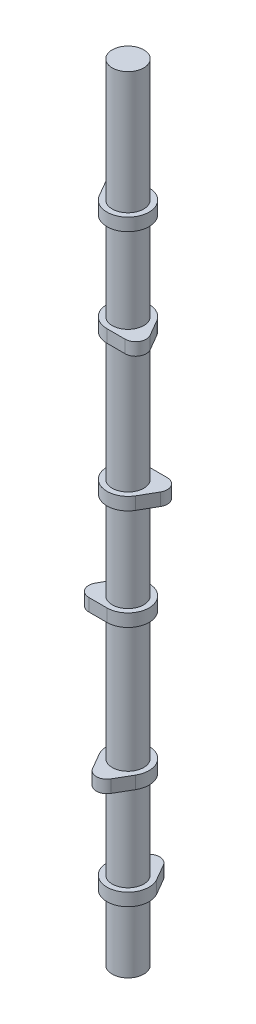
ISO-10303-21;
HEADER;
FILE_DESCRIPTION(('STEP AP214'),'2;1');
FILE_NAME('part.step','',(''),(''),'','','');
FILE_SCHEMA(('AUTOMOTIVE_DESIGN { 1 0 10303 214 1 1 1 1 }'));
ENDSEC;
DATA;
#1=APPLICATION_CONTEXT('core data for automotive mechanical design processes');
#2=APPLICATION_PROTOCOL_DEFINITION('international standard','automotive_design',2000,#1);
#3=PRODUCT_CONTEXT('',#1,'mechanical');
#4=PRODUCT('Part','Part','',(#3));
#5=PRODUCT_RELATED_PRODUCT_CATEGORY('part','',(#4));
#6=PRODUCT_DEFINITION_FORMATION('','',#4);
#7=PRODUCT_DEFINITION_CONTEXT('part definition',#1,'design');
#8=PRODUCT_DEFINITION('design','',#6,#7);
#9=PRODUCT_DEFINITION_SHAPE('','',#8);
#10=(LENGTH_UNIT() NAMED_UNIT(*) SI_UNIT(.MILLI.,.METRE.));
#11=(NAMED_UNIT(*) PLANE_ANGLE_UNIT() SI_UNIT($,.RADIAN.));
#12=(NAMED_UNIT(*) SI_UNIT($,.STERADIAN.) SOLID_ANGLE_UNIT());
#13=UNCERTAINTY_MEASURE_WITH_UNIT(LENGTH_MEASURE(1.E-05),#10,'distance_accuracy_value','');
#14=(GEOMETRIC_REPRESENTATION_CONTEXT(3) GLOBAL_UNCERTAINTY_ASSIGNED_CONTEXT((#13)) GLOBAL_UNIT_ASSIGNED_CONTEXT((#10,
#11,#12)) REPRESENTATION_CONTEXT('',''));
#15=CARTESIAN_POINT('',(0.,0.,0.));
#16=DIRECTION('',(0.,0.,1.));
#17=DIRECTION('',(1.,0.,0.));
#18=AXIS2_PLACEMENT_3D('',#15,#16,#17);
#19=CARTESIAN_POINT('',(0.,64.77,12.7));
#20=DIRECTION('',(0.,-1.,0.));
#21=DIRECTION('',(0.,0.,1.));
#22=AXIS2_PLACEMENT_3D('',#19,#20,#21);
#23=CYLINDRICAL_SURFACE('',#22,6.35);
#24=CARTESIAN_POINT('',(0.,57.15,12.7));
#25=DIRECTION('',(0.,1.,0.));
#26=DIRECTION('',(0.,0.,-1.));
#27=AXIS2_PLACEMENT_3D('',#24,#25,#26);
#28=CIRCLE('',#27,6.35);
#29=CARTESIAN_POINT('',(-5.49926131403129,57.15,15.875));
#30=VERTEX_POINT('',#29);
#31=CARTESIAN_POINT('',(5.49926131403107,57.15,15.875));
#32=VERTEX_POINT('',#31);
#33=EDGE_CURVE('E389',#30,#32,#28,.T.);
#34=ORIENTED_EDGE('',*,*,#33,.T.);
#35=DIRECTION('',(0.,-1.,0.));
#36=VECTOR('',#35,1.);
#37=CARTESIAN_POINT('',(5.49926131403107,64.77,15.875));
#38=LINE('',#37,#36);
#39=CARTESIAN_POINT('',(5.49926131403107,64.77,15.875));
#40=VERTEX_POINT('',#39);
#41=EDGE_CURVE('E408',#40,#32,#38,.T.);
#42=ORIENTED_EDGE('',*,*,#41,.F.);
#43=CARTESIAN_POINT('',(0.,64.77,12.7));
#44=DIRECTION('',(0.,1.,0.));
#45=DIRECTION('',(0.,0.,-1.));
#46=AXIS2_PLACEMENT_3D('',#43,#44,#45);
#47=CIRCLE('',#46,6.35);
#48=CARTESIAN_POINT('',(-5.49926131403129,64.77,15.875));
#49=VERTEX_POINT('',#48);
#50=EDGE_CURVE('E390',#49,#40,#47,.T.);
#51=ORIENTED_EDGE('',*,*,#50,.F.);
#52=DIRECTION('',(0.,-1.,0.));
#53=VECTOR('',#52,1.);
#54=CARTESIAN_POINT('',(-5.49926131403129,64.77,15.875));
#55=LINE('',#54,#53);
#56=EDGE_CURVE('E396',#49,#30,#55,.T.);
#57=ORIENTED_EDGE('',*,*,#56,.T.);
#58=EDGE_LOOP('',(#34,#42,#51,#57));
#59=FACE_BOUND('',#58,.T.);
#60=ADVANCED_FACE('F37',(#59),#23,.T.);
#61=CARTESIAN_POINT('',(5.49926131403107,64.77,15.875));
#62=DIRECTION('',(-0.866025403784435,0.,-0.500000000000006));
#63=DIRECTION('',(-0.500000000000006,0.,0.866025403784435));
#64=AXIS2_PLACEMENT_3D('',#61,#62,#63);
#65=PLANE('',#64);
#66=DIRECTION('',(0.500000000000006,0.,-0.866025403784435));
#67=VECTOR('',#66,1.);
#68=CARTESIAN_POINT('',(5.49926131403107,57.15,15.875));
#69=LINE('',#68,#67);
#70=CARTESIAN_POINT('',(10.9985226280623,57.15,6.35000000000008));
#71=VERTEX_POINT('',#70);
#72=EDGE_CURVE('E399',#32,#71,#69,.T.);
#73=ORIENTED_EDGE('',*,*,#72,.T.);
#74=DIRECTION('',(0.,-1.,0.));
#75=VECTOR('',#74,1.);
#76=CARTESIAN_POINT('',(10.9985226280623,64.77,6.35000000000008));
#77=LINE('',#76,#75);
#78=CARTESIAN_POINT('',(10.9985226280623,64.77,6.35000000000008));
#79=VERTEX_POINT('',#78);
#80=EDGE_CURVE('E406',#79,#71,#77,.T.);
#81=ORIENTED_EDGE('',*,*,#80,.F.);
#82=DIRECTION('',(0.500000000000006,0.,-0.866025403784435));
#83=VECTOR('',#82,1.);
#84=CARTESIAN_POINT('',(5.49926131403107,64.77,15.875));
#85=LINE('',#84,#83);
#86=EDGE_CURVE('E86',#40,#79,#85,.T.);
#87=ORIENTED_EDGE('',*,*,#86,.F.);
#88=ORIENTED_EDGE('',*,*,#41,.T.);
#89=EDGE_LOOP('',(#73,#81,#87,#88));
#90=FACE_BOUND('',#89,.T.);
#91=ADVANCED_FACE('F427',(#90),#65,.F.);
#92=CARTESIAN_POINT('',(0.,64.77,0.));
#93=DIRECTION('',(0.,-1.,0.));
#94=DIRECTION('',(0.,0.,1.));
#95=AXIS2_PLACEMENT_3D('',#92,#93,#94);
#96=CYLINDRICAL_SURFACE('',#95,12.7);
#97=CARTESIAN_POINT('',(0.,57.15,0.));
#98=DIRECTION('',(0.,1.,0.));
#99=DIRECTION('',(0.,0.,-1.));
#100=AXIS2_PLACEMENT_3D('',#97,#98,#99);
#101=CIRCLE('',#100,12.7);
#102=CARTESIAN_POINT('',(-10.9985226280624,57.15,6.34999999999992));
#103=VERTEX_POINT('',#102);
#104=EDGE_CURVE('E72',#71,#103,#101,.T.);
#105=ORIENTED_EDGE('',*,*,#104,.T.);
#106=DIRECTION('',(0.,-1.,0.));
#107=VECTOR('',#106,1.);
#108=CARTESIAN_POINT('',(-10.9985226280624,64.77,6.34999999999992));
#109=LINE('',#108,#107);
#110=CARTESIAN_POINT('',(-10.9985226280624,64.77,6.34999999999992));
#111=VERTEX_POINT('',#110);
#112=EDGE_CURVE('E404',#111,#103,#109,.T.);
#113=ORIENTED_EDGE('',*,*,#112,.F.);
#114=CARTESIAN_POINT('',(0.,64.77,0.));
#115=DIRECTION('',(0.,1.,0.));
#116=DIRECTION('',(0.,0.,-1.));
#117=AXIS2_PLACEMENT_3D('',#114,#115,#116);
#118=CIRCLE('',#117,12.7);
#119=EDGE_CURVE('E393',#79,#111,#118,.T.);
#120=ORIENTED_EDGE('',*,*,#119,.F.);
#121=ORIENTED_EDGE('',*,*,#80,.T.);
#122=EDGE_LOOP('',(#105,#113,#120,#121));
#123=FACE_BOUND('',#122,.T.);
#124=ADVANCED_FACE('F426',(#123),#96,.T.);
#125=CARTESIAN_POINT('',(-5.49926131403129,64.77,15.875));
#126=DIRECTION('',(0.866025403784442,0.,-0.499999999999994));
#127=DIRECTION('',(-0.499999999999994,0.,-0.866025403784442));
#128=AXIS2_PLACEMENT_3D('',#125,#126,#127);
#129=PLANE('',#128);
#130=DIRECTION('',(0.499999999999994,0.,0.866025403784442));
#131=VECTOR('',#130,1.);
#132=CARTESIAN_POINT('',(-5.49926131403129,57.15,15.875));
#133=LINE('',#132,#131);
#134=EDGE_CURVE('E78',#103,#30,#133,.T.);
#135=ORIENTED_EDGE('',*,*,#134,.T.);
#136=ORIENTED_EDGE('',*,*,#56,.F.);
#137=DIRECTION('',(0.499999999999994,0.,0.866025403784442));
#138=VECTOR('',#137,1.);
#139=CARTESIAN_POINT('',(-5.49926131403129,64.77,15.875));
#140=LINE('',#139,#138);
#141=EDGE_CURVE('E54',#111,#49,#140,.T.);
#142=ORIENTED_EDGE('',*,*,#141,.F.);
#143=ORIENTED_EDGE('',*,*,#112,.T.);
#144=EDGE_LOOP('',(#135,#136,#142,#143));
#145=FACE_BOUND('',#144,.T.);
#146=ADVANCED_FACE('F424',(#145),#129,.F.);
#147=CARTESIAN_POINT('',(0.,64.77,12.7));
#148=DIRECTION('',(0.,1.,0.));
#149=DIRECTION('',(0.,0.,-1.));
#150=AXIS2_PLACEMENT_3D('',#147,#148,#149);
#151=PLANE('',#150);
#152=CARTESIAN_POINT('',(0.,64.77,0.));
#153=DIRECTION('',(0.,1.,0.));
#154=DIRECTION('',(0.,0.,1.));
#155=AXIS2_PLACEMENT_3D('',#152,#153,#154);
#156=CIRCLE('',#155,9.5);
#157=CARTESIAN_POINT('',(0.,64.77,9.5));
#158=VERTEX_POINT('',#157);
#159=EDGE_CURVE('E386',#158,#158,#156,.F.);
#160=ORIENTED_EDGE('',*,*,#159,.T.);
#161=EDGE_LOOP('',(#160));
#162=FACE_BOUND('',#161,.T.);
#163=ORIENTED_EDGE('',*,*,#50,.T.);
#164=ORIENTED_EDGE('',*,*,#86,.T.);
#165=ORIENTED_EDGE('',*,*,#119,.T.);
#166=ORIENTED_EDGE('',*,*,#141,.T.);
#167=EDGE_LOOP('',(#163,#164,#165,#166));
#168=FACE_BOUND('',#167,.T.);
#169=ADVANCED_FACE('F418',(#162,#168),#151,.T.);
#170=CARTESIAN_POINT('',(0.,57.15,12.7));
#171=DIRECTION('',(0.,1.,0.));
#172=DIRECTION('',(0.,0.,-1.));
#173=AXIS2_PLACEMENT_3D('',#170,#171,#172);
#174=PLANE('',#173);
#175=CARTESIAN_POINT('',(0.,57.15,0.));
#176=DIRECTION('',(0.,1.,0.));
#177=DIRECTION('',(0.,0.,1.));
#178=AXIS2_PLACEMENT_3D('',#175,#176,#177);
#179=CIRCLE('',#178,9.5);
#180=CARTESIAN_POINT('',(0.,57.15,9.5));
#181=VERTEX_POINT('',#180);
#182=EDGE_CURVE('E46',#181,#181,#179,.F.);
#183=ORIENTED_EDGE('',*,*,#182,.F.);
#184=EDGE_LOOP('',(#183));
#185=FACE_BOUND('',#184,.T.);
#186=ORIENTED_EDGE('',*,*,#33,.F.);
#187=ORIENTED_EDGE('',*,*,#134,.F.);
#188=ORIENTED_EDGE('',*,*,#104,.F.);
#189=ORIENTED_EDGE('',*,*,#72,.F.);
#190=EDGE_LOOP('',(#186,#187,#188,#189));
#191=FACE_BOUND('',#190,.T.);
#192=ADVANCED_FACE('F415',(#185,#191),#174,.F.);
#193=CARTESIAN_POINT('',(0.,120.65,0.));
#194=DIRECTION('',(0.,-1.,0.));
#195=DIRECTION('',(0.,0.,-1.));
#196=AXIS2_PLACEMENT_3D('',#193,#194,#195);
#197=CYLINDRICAL_SURFACE('',#196,9.5);
#198=CARTESIAN_POINT('',(0.,3.80999999999999,0.));
#199=DIRECTION('',(0.,1.,0.));
#200=DIRECTION('',(0.,0.,1.));
#201=AXIS2_PLACEMENT_3D('',#198,#199,#200);
#202=CIRCLE('',#201,9.5);
#203=CARTESIAN_POINT('',(0.,3.80999999999999,9.5));
#204=VERTEX_POINT('',#203);
#205=EDGE_CURVE('E40',#204,#204,#202,.T.);
#206=ORIENTED_EDGE('',*,*,#205,.T.);
#207=EDGE_LOOP('',(#206));
#208=FACE_BOUND('',#207,.T.);
#209=ORIENTED_EDGE('',*,*,#182,.T.);
#210=EDGE_LOOP('',(#209));
#211=FACE_BOUND('',#210,.T.);
#212=ADVANCED_FACE('F413',(#208,#211),#197,.T.);
#213=ORIENTED_EDGE('',*,*,#159,.F.);
#214=EDGE_LOOP('',(#213));
#215=FACE_BOUND('',#214,.T.);
#216=CARTESIAN_POINT('',(0.,142.24,0.));
#217=DIRECTION('',(0.,1.,0.));
#218=DIRECTION('',(0.866025403784436,0.,-0.500000000000004));
#219=AXIS2_PLACEMENT_3D('',#216,#217,#218);
#220=CIRCLE('',#219,9.5);
#221=CARTESIAN_POINT('',(8.22724133595215,142.24,-4.75000000000004));
#222=VERTEX_POINT('',#221);
#223=EDGE_CURVE('E348',#222,#222,#220,.T.);
#224=ORIENTED_EDGE('',*,*,#223,.F.);
#225=EDGE_LOOP('',(#224));
#226=FACE_BOUND('',#225,.T.);
#227=ADVANCED_FACE('F440',(#215,#226),#197,.T.);
#228=CARTESIAN_POINT('',(0.,3.81,-12.7));
#229=DIRECTION('',(0.,-1.,0.));
#230=DIRECTION('',(0.,0.,-1.));
#231=AXIS2_PLACEMENT_3D('',#228,#229,#230);
#232=CYLINDRICAL_SURFACE('',#231,6.35);
#233=CARTESIAN_POINT('',(0.,-3.81,-12.7));
#234=DIRECTION('',(0.,1.,0.));
#235=DIRECTION('',(0.,0.,1.));
#236=AXIS2_PLACEMENT_3D('',#233,#234,#235);
#237=CIRCLE('',#236,6.35);
#238=CARTESIAN_POINT('',(5.49926131403118,-3.81,-15.875));
#239=VERTEX_POINT('',#238);
#240=CARTESIAN_POINT('',(-5.49926131403118,-3.81,-15.875));
#241=VERTEX_POINT('',#240);
#242=EDGE_CURVE('E356',#239,#241,#237,.T.);
#243=ORIENTED_EDGE('',*,*,#242,.T.);
#244=DIRECTION('',(0.,-1.,0.));
#245=VECTOR('',#244,1.);
#246=CARTESIAN_POINT('',(-5.49926131403118,3.81,-15.875));
#247=LINE('',#246,#245);
#248=CARTESIAN_POINT('',(-5.49926131403118,3.81,-15.875));
#249=VERTEX_POINT('',#248);
#250=EDGE_CURVE('E383',#249,#241,#247,.T.);
#251=ORIENTED_EDGE('',*,*,#250,.F.);
#252=CARTESIAN_POINT('',(0.,3.81,-12.7));
#253=DIRECTION('',(0.,1.,0.));
#254=DIRECTION('',(0.,0.,1.));
#255=AXIS2_PLACEMENT_3D('',#252,#253,#254);
#256=CIRCLE('',#255,6.35);
#257=CARTESIAN_POINT('',(5.49926131403118,3.81,-15.875));
#258=VERTEX_POINT('',#257);
#259=EDGE_CURVE('E357',#258,#249,#256,.T.);
#260=ORIENTED_EDGE('',*,*,#259,.F.);
#261=DIRECTION('',(0.,-1.,0.));
#262=VECTOR('',#261,1.);
#263=CARTESIAN_POINT('',(5.49926131403118,3.81,-15.875));
#264=LINE('',#263,#262);
#265=EDGE_CURVE('E367',#258,#239,#264,.T.);
#266=ORIENTED_EDGE('',*,*,#265,.T.);
#267=EDGE_LOOP('',(#243,#251,#260,#266));
#268=FACE_BOUND('',#267,.T.);
#269=ADVANCED_FACE('F443',(#268),#232,.T.);
#270=CARTESIAN_POINT('',(-5.49926131403118,3.81,-15.875));
#271=DIRECTION('',(0.866025403784438,0.,0.5));
#272=DIRECTION('',(0.5,0.,-0.866025403784439));
#273=AXIS2_PLACEMENT_3D('',#270,#271,#272);
#274=PLANE('',#273);
#275=DIRECTION('',(-0.5,0.,0.866025403784439));
#276=VECTOR('',#275,1.);
#277=CARTESIAN_POINT('',(-5.49926131403118,-3.81,-15.875));
#278=LINE('',#277,#276);
#279=CARTESIAN_POINT('',(-10.9985226280624,-3.81,-6.35));
#280=VERTEX_POINT('',#279);
#281=EDGE_CURVE('E370',#241,#280,#278,.T.);
#282=ORIENTED_EDGE('',*,*,#281,.T.);
#283=DIRECTION('',(0.,-1.,0.));
#284=VECTOR('',#283,1.);
#285=CARTESIAN_POINT('',(-10.9985226280624,3.81,-6.35));
#286=LINE('',#285,#284);
#287=CARTESIAN_POINT('',(-10.9985226280624,3.81,-6.35));
#288=VERTEX_POINT('',#287);
#289=EDGE_CURVE('E380',#288,#280,#286,.T.);
#290=ORIENTED_EDGE('',*,*,#289,.F.);
#291=DIRECTION('',(-0.5,0.,0.866025403784439));
#292=VECTOR('',#291,1.);
#293=CARTESIAN_POINT('',(-5.49926131403118,3.81,-15.875));
#294=LINE('',#293,#292);
#295=EDGE_CURVE('E360',#249,#288,#294,.T.);
#296=ORIENTED_EDGE('',*,*,#295,.F.);
#297=ORIENTED_EDGE('',*,*,#250,.T.);
#298=EDGE_LOOP('',(#282,#290,#296,#297));
#299=FACE_BOUND('',#298,.T.);
#300=ADVANCED_FACE('F448',(#299),#274,.F.);
#301=CARTESIAN_POINT('',(0.,3.81,0.));
#302=DIRECTION('',(0.,-1.,0.));
#303=DIRECTION('',(0.,0.,-1.));
#304=AXIS2_PLACEMENT_3D('',#301,#302,#303);
#305=CYLINDRICAL_SURFACE('',#304,12.7);
#306=CARTESIAN_POINT('',(0.,-3.81,0.));
#307=DIRECTION('',(0.,1.,0.));
#308=DIRECTION('',(0.,0.,1.));
#309=AXIS2_PLACEMENT_3D('',#306,#307,#308);
#310=CIRCLE('',#309,12.7);
#311=CARTESIAN_POINT('',(10.9985226280624,-3.81,-6.35));
#312=VERTEX_POINT('',#311);
#313=EDGE_CURVE('E372',#280,#312,#310,.T.);
#314=ORIENTED_EDGE('',*,*,#313,.T.);
#315=DIRECTION('',(0.,-1.,0.));
#316=VECTOR('',#315,1.);
#317=CARTESIAN_POINT('',(10.9985226280624,3.81,-6.35));
#318=LINE('',#317,#316);
#319=CARTESIAN_POINT('',(10.9985226280624,3.81,-6.35));
#320=VERTEX_POINT('',#319);
#321=EDGE_CURVE('E377',#320,#312,#318,.T.);
#322=ORIENTED_EDGE('',*,*,#321,.F.);
#323=CARTESIAN_POINT('',(0.,3.81,0.));
#324=DIRECTION('',(0.,1.,0.));
#325=DIRECTION('',(0.,0.,1.));
#326=AXIS2_PLACEMENT_3D('',#323,#324,#325);
#327=CIRCLE('',#326,12.7);
#328=EDGE_CURVE('E363',#288,#320,#327,.T.);
#329=ORIENTED_EDGE('',*,*,#328,.F.);
#330=ORIENTED_EDGE('',*,*,#289,.T.);
#331=EDGE_LOOP('',(#314,#322,#329,#330));
#332=FACE_BOUND('',#331,.T.);
#333=ADVANCED_FACE('F452',(#332),#305,.T.);
#334=CARTESIAN_POINT('',(5.49926131403118,3.81,-15.875));
#335=DIRECTION('',(-0.866025403784439,0.,0.5));
#336=DIRECTION('',(0.5,0.,0.866025403784439));
#337=AXIS2_PLACEMENT_3D('',#334,#335,#336);
#338=PLANE('',#337);
#339=DIRECTION('',(-0.5,0.,-0.866025403784439));
#340=VECTOR('',#339,1.);
#341=CARTESIAN_POINT('',(5.49926131403118,-3.81,-15.875));
#342=LINE('',#341,#340);
#343=EDGE_CURVE('E361',#312,#239,#342,.T.);
#344=ORIENTED_EDGE('',*,*,#343,.T.);
#345=ORIENTED_EDGE('',*,*,#265,.F.);
#346=DIRECTION('',(-0.5,0.,-0.866025403784439));
#347=VECTOR('',#346,1.);
#348=CARTESIAN_POINT('',(5.49926131403118,3.81,-15.875));
#349=LINE('',#348,#347);
#350=EDGE_CURVE('E365',#320,#258,#349,.T.);
#351=ORIENTED_EDGE('',*,*,#350,.F.);
#352=ORIENTED_EDGE('',*,*,#321,.T.);
#353=EDGE_LOOP('',(#344,#345,#351,#352));
#354=FACE_BOUND('',#353,.T.);
#355=ADVANCED_FACE('F456',(#354),#338,.F.);
#356=CARTESIAN_POINT('',(0.,3.81,-12.7));
#357=DIRECTION('',(0.,1.,0.));
#358=DIRECTION('',(0.,0.,1.));
#359=AXIS2_PLACEMENT_3D('',#356,#357,#358);
#360=PLANE('',#359);
#361=ORIENTED_EDGE('',*,*,#205,.F.);
#362=EDGE_LOOP('',(#361));
#363=FACE_BOUND('',#362,.T.);
#364=ORIENTED_EDGE('',*,*,#259,.T.);
#365=ORIENTED_EDGE('',*,*,#295,.T.);
#366=ORIENTED_EDGE('',*,*,#328,.T.);
#367=ORIENTED_EDGE('',*,*,#350,.T.);
#368=EDGE_LOOP('',(#364,#365,#366,#367));
#369=FACE_BOUND('',#368,.T.);
#370=ADVANCED_FACE('F460',(#363,#369),#360,.T.);
#371=CARTESIAN_POINT('',(0.,-3.81,-12.7));
#372=DIRECTION('',(0.,1.,0.));
#373=DIRECTION('',(0.,0.,1.));
#374=AXIS2_PLACEMENT_3D('',#371,#372,#373);
#375=PLANE('',#374);
#376=CARTESIAN_POINT('',(0.,-3.80999999999999,0.));
#377=DIRECTION('',(0.,1.,0.));
#378=DIRECTION('',(0.,0.,1.));
#379=AXIS2_PLACEMENT_3D('',#376,#377,#378);
#380=CIRCLE('',#379,9.5);
#381=CARTESIAN_POINT('',(0.,-3.80999999999999,9.5));
#382=VERTEX_POINT('',#381);
#383=EDGE_CURVE('E11',#382,#382,#380,.T.);
#384=ORIENTED_EDGE('',*,*,#383,.T.);
#385=EDGE_LOOP('',(#384));
#386=FACE_BOUND('',#385,.T.);
#387=ORIENTED_EDGE('',*,*,#242,.F.);
#388=ORIENTED_EDGE('',*,*,#343,.F.);
#389=ORIENTED_EDGE('',*,*,#313,.F.);
#390=ORIENTED_EDGE('',*,*,#281,.F.);
#391=EDGE_LOOP('',(#387,#388,#389,#390));
#392=FACE_BOUND('',#391,.T.);
#393=ADVANCED_FACE('F462',(#386,#392),#375,.F.);
#394=ORIENTED_EDGE('',*,*,#383,.F.);
#395=EDGE_LOOP('',(#394));
#396=FACE_BOUND('',#395,.T.);
#397=CARTESIAN_POINT('',(0.,-43.34,0.));
#398=DIRECTION('',(0.,-1.,0.));
#399=DIRECTION('',(0.,0.,-1.));
#400=AXIS2_PLACEMENT_3D('',#397,#398,#399);
#401=CIRCLE('',#400,9.5);
#402=CARTESIAN_POINT('',(0.,-43.34,-9.5));
#403=VERTEX_POINT('',#402);
#404=EDGE_CURVE('E351',#403,#403,#401,.T.);
#405=ORIENTED_EDGE('',*,*,#404,.F.);
#406=EDGE_LOOP('',(#405));
#407=FACE_BOUND('',#406,.T.);
#408=ADVANCED_FACE('F445',(#396,#407),#197,.T.);
#409=CARTESIAN_POINT('',(0.,-43.34,0.));
#410=DIRECTION('',(0.,-1.,0.));
#411=DIRECTION('',(0.,0.,-1.));
#412=AXIS2_PLACEMENT_3D('',#409,#410,#411);
#413=PLANE('',#412);
#414=ORIENTED_EDGE('',*,*,#404,.T.);
#415=EDGE_LOOP('',(#414));
#416=FACE_BOUND('',#415,.T.);
#417=ADVANCED_FACE('F469',(#416),#413,.T.);
#418=CARTESIAN_POINT('',(10.9985226280624,210.82,-6.34999999999997));
#419=DIRECTION('',(0.,-1.,0.));
#420=DIRECTION('',(0.86602540378444,0.,-0.499999999999998));
#421=AXIS2_PLACEMENT_3D('',#418,#419,#420);
#422=CYLINDRICAL_SURFACE('',#421,6.35);
#423=CARTESIAN_POINT('',(10.9985226280624,203.2,-6.34999999999997));
#424=DIRECTION('',(0.,1.,0.));
#425=DIRECTION('',(-0.86602540378444,0.,0.499999999999998));
#426=AXIS2_PLACEMENT_3D('',#423,#424,#425);
#427=CIRCLE('',#426,6.35);
#428=CARTESIAN_POINT('',(16.4977839420936,203.2,-3.17499999999997));
#429=VERTEX_POINT('',#428);
#430=CARTESIAN_POINT('',(10.9985226280624,203.2,-12.7));
#431=VERTEX_POINT('',#430);
#432=EDGE_CURVE('E315',#429,#431,#427,.T.);
#433=ORIENTED_EDGE('',*,*,#432,.T.);
#434=DIRECTION('',(0.,-1.,0.));
#435=VECTOR('',#434,1.);
#436=CARTESIAN_POINT('',(10.9985226280624,210.82,-12.7));
#437=LINE('',#436,#435);
#438=CARTESIAN_POINT('',(10.9985226280624,210.82,-12.7));
#439=VERTEX_POINT('',#438);
#440=EDGE_CURVE('E342',#439,#431,#437,.T.);
#441=ORIENTED_EDGE('',*,*,#440,.F.);
#442=CARTESIAN_POINT('',(10.9985226280624,210.82,-6.34999999999997));
#443=DIRECTION('',(0.,1.,0.));
#444=DIRECTION('',(-0.86602540378444,0.,0.499999999999998));
#445=AXIS2_PLACEMENT_3D('',#442,#443,#444);
#446=CIRCLE('',#445,6.35);
#447=CARTESIAN_POINT('',(16.4977839420936,210.82,-3.17499999999997));
#448=VERTEX_POINT('',#447);
#449=EDGE_CURVE('E316',#448,#439,#446,.T.);
#450=ORIENTED_EDGE('',*,*,#449,.F.);
#451=DIRECTION('',(0.,-1.,0.));
#452=VECTOR('',#451,1.);
#453=CARTESIAN_POINT('',(16.4977839420936,210.82,-3.17499999999997));
#454=LINE('',#453,#452);
#455=EDGE_CURVE('E326',#448,#429,#454,.T.);
#456=ORIENTED_EDGE('',*,*,#455,.T.);
#457=EDGE_LOOP('',(#433,#441,#450,#456));
#458=FACE_BOUND('',#457,.T.);
#459=ADVANCED_FACE('F472',(#458),#422,.T.);
#460=CARTESIAN_POINT('',(10.9985226280624,210.82,-12.7));
#461=DIRECTION('',(0.,0.,1.));
#462=DIRECTION('',(1.,0.,0.));
#463=AXIS2_PLACEMENT_3D('',#460,#461,#462);
#464=PLANE('',#463);
#465=DIRECTION('',(-1.,0.,0.));
#466=VECTOR('',#465,1.);
#467=CARTESIAN_POINT('',(10.9985226280624,203.2,-12.7));
#468=LINE('',#467,#466);
#469=CARTESIAN_POINT('',(0.,203.2,-12.7));
#470=VERTEX_POINT('',#469);
#471=EDGE_CURVE('E329',#431,#470,#468,.T.);
#472=ORIENTED_EDGE('',*,*,#471,.T.);
#473=DIRECTION('',(0.,-1.,0.));
#474=VECTOR('',#473,1.);
#475=CARTESIAN_POINT('',(0.,210.82,-12.7));
#476=LINE('',#475,#474);
#477=CARTESIAN_POINT('',(0.,210.82,-12.7));
#478=VERTEX_POINT('',#477);
#479=EDGE_CURVE('E339',#478,#470,#476,.T.);
#480=ORIENTED_EDGE('',*,*,#479,.F.);
#481=DIRECTION('',(-1.,0.,0.));
#482=VECTOR('',#481,1.);
#483=CARTESIAN_POINT('',(10.9985226280624,210.82,-12.7));
#484=LINE('',#483,#482);
#485=EDGE_CURVE('E319',#439,#478,#484,.T.);
#486=ORIENTED_EDGE('',*,*,#485,.F.);
#487=ORIENTED_EDGE('',*,*,#440,.T.);
#488=EDGE_LOOP('',(#472,#480,#486,#487));
#489=FACE_BOUND('',#488,.T.);
#490=ADVANCED_FACE('F476',(#489),#464,.F.);
#491=CARTESIAN_POINT('',(0.,210.82,0.));
#492=DIRECTION('',(0.,-1.,0.));
#493=DIRECTION('',(0.86602540378444,0.,-0.499999999999998));
#494=AXIS2_PLACEMENT_3D('',#491,#492,#493);
#495=CYLINDRICAL_SURFACE('',#494,12.7);
#496=CARTESIAN_POINT('',(0.,203.2,0.));
#497=DIRECTION('',(0.,1.,0.));
#498=DIRECTION('',(-0.86602540378444,0.,0.499999999999998));
#499=AXIS2_PLACEMENT_3D('',#496,#497,#498);
#500=CIRCLE('',#499,12.7);
#501=CARTESIAN_POINT('',(10.9985226280624,203.2,6.35000000000002));
#502=VERTEX_POINT('',#501);
#503=EDGE_CURVE('E331',#470,#502,#500,.T.);
#504=ORIENTED_EDGE('',*,*,#503,.T.);
#505=DIRECTION('',(0.,-1.,0.));
#506=VECTOR('',#505,1.);
#507=CARTESIAN_POINT('',(10.9985226280624,210.82,6.35000000000002));
#508=LINE('',#507,#506);
#509=CARTESIAN_POINT('',(10.9985226280624,210.82,6.35000000000002));
#510=VERTEX_POINT('',#509);
#511=EDGE_CURVE('E336',#510,#502,#508,.T.);
#512=ORIENTED_EDGE('',*,*,#511,.F.);
#513=CARTESIAN_POINT('',(0.,210.82,0.));
#514=DIRECTION('',(0.,1.,0.));
#515=DIRECTION('',(-0.86602540378444,0.,0.499999999999998));
#516=AXIS2_PLACEMENT_3D('',#513,#514,#515);
#517=CIRCLE('',#516,12.7);
#518=EDGE_CURVE('E322',#478,#510,#517,.T.);
#519=ORIENTED_EDGE('',*,*,#518,.F.);
#520=ORIENTED_EDGE('',*,*,#479,.T.);
#521=EDGE_LOOP('',(#504,#512,#519,#520));
#522=FACE_BOUND('',#521,.T.);
#523=ADVANCED_FACE('F480',(#522),#495,.T.);
#524=CARTESIAN_POINT('',(16.4977839420936,210.82,-3.17499999999997));
#525=DIRECTION('',(-0.866025403784438,0.,-0.500000000000002));
#526=DIRECTION('',(-0.500000000000002,0.,0.866025403784438));
#527=AXIS2_PLACEMENT_3D('',#524,#525,#526);
#528=PLANE('',#527);
#529=DIRECTION('',(0.500000000000002,0.,-0.866025403784438));
#530=VECTOR('',#529,1.);
#531=CARTESIAN_POINT('',(16.4977839420936,203.2,-3.17499999999997));
#532=LINE('',#531,#530);
#533=EDGE_CURVE('E320',#502,#429,#532,.T.);
#534=ORIENTED_EDGE('',*,*,#533,.T.);
#535=ORIENTED_EDGE('',*,*,#455,.F.);
#536=DIRECTION('',(0.500000000000002,0.,-0.866025403784438));
#537=VECTOR('',#536,1.);
#538=CARTESIAN_POINT('',(16.4977839420936,210.82,-3.17499999999997));
#539=LINE('',#538,#537);
#540=EDGE_CURVE('E324',#510,#448,#539,.T.);
#541=ORIENTED_EDGE('',*,*,#540,.F.);
#542=ORIENTED_EDGE('',*,*,#511,.T.);
#543=EDGE_LOOP('',(#534,#535,#541,#542));
#544=FACE_BOUND('',#543,.T.);
#545=ADVANCED_FACE('F484',(#544),#528,.F.);
#546=CARTESIAN_POINT('',(10.9985226280624,210.82,-6.34999999999997));
#547=DIRECTION('',(0.,1.,0.));
#548=DIRECTION('',(-0.86602540378444,0.,0.499999999999998));
#549=AXIS2_PLACEMENT_3D('',#546,#547,#548);
#550=PLANE('',#549);
#551=CARTESIAN_POINT('',(0.,210.82,0.));
#552=DIRECTION('',(0.,1.,0.));
#553=DIRECTION('',(0.866025403784436,0.,-0.500000000000004));
#554=AXIS2_PLACEMENT_3D('',#551,#552,#553);
#555=CIRCLE('',#554,9.5);
#556=CARTESIAN_POINT('',(8.22724133595215,210.82,-4.75000000000004));
#557=VERTEX_POINT('',#556);
#558=EDGE_CURVE('E312',#557,#557,#555,.F.);
#559=ORIENTED_EDGE('',*,*,#558,.T.);
#560=EDGE_LOOP('',(#559));
#561=FACE_BOUND('',#560,.T.);
#562=ORIENTED_EDGE('',*,*,#449,.T.);
#563=ORIENTED_EDGE('',*,*,#485,.T.);
#564=ORIENTED_EDGE('',*,*,#518,.T.);
#565=ORIENTED_EDGE('',*,*,#540,.T.);
#566=EDGE_LOOP('',(#562,#563,#564,#565));
#567=FACE_BOUND('',#566,.T.);
#568=ADVANCED_FACE('F488',(#561,#567),#550,.T.);
#569=CARTESIAN_POINT('',(10.9985226280624,203.2,-6.34999999999997));
#570=DIRECTION('',(0.,1.,0.));
#571=DIRECTION('',(-0.86602540378444,0.,0.499999999999998));
#572=AXIS2_PLACEMENT_3D('',#569,#570,#571);
#573=PLANE('',#572);
#574=CARTESIAN_POINT('',(0.,203.2,0.));
#575=DIRECTION('',(0.,1.,0.));
#576=DIRECTION('',(0.866025403784436,0.,-0.500000000000004));
#577=AXIS2_PLACEMENT_3D('',#574,#575,#576);
#578=CIRCLE('',#577,9.5);
#579=CARTESIAN_POINT('',(8.22724133595215,203.2,-4.75000000000004));
#580=VERTEX_POINT('',#579);
#581=EDGE_CURVE('E345',#580,#580,#578,.F.);
#582=ORIENTED_EDGE('',*,*,#581,.F.);
#583=EDGE_LOOP('',(#582));
#584=FACE_BOUND('',#583,.T.);
#585=ORIENTED_EDGE('',*,*,#432,.F.);
#586=ORIENTED_EDGE('',*,*,#533,.F.);
#587=ORIENTED_EDGE('',*,*,#503,.F.);
#588=ORIENTED_EDGE('',*,*,#471,.F.);
#589=EDGE_LOOP('',(#585,#586,#587,#588));
#590=FACE_BOUND('',#589,.T.);
#591=ADVANCED_FACE('F490',(#584,#590),#573,.F.);
#592=CARTESIAN_POINT('',(0.,266.7,0.));
#593=DIRECTION('',(0.,-1.,0.));
#594=DIRECTION('',(-0.866025403784436,0.,0.500000000000004));
#595=AXIS2_PLACEMENT_3D('',#592,#593,#594);
#596=CYLINDRICAL_SURFACE('',#595,9.5);
#597=CARTESIAN_POINT('',(0.,149.86,0.));
#598=DIRECTION('',(0.,1.,0.));
#599=DIRECTION('',(0.866025403784436,0.,-0.500000000000004));
#600=AXIS2_PLACEMENT_3D('',#597,#598,#599);
#601=CIRCLE('',#600,9.5);
#602=CARTESIAN_POINT('',(8.22724133595215,149.86,-4.75000000000004));
#603=VERTEX_POINT('',#602);
#604=EDGE_CURVE('E311',#603,#603,#601,.T.);
#605=ORIENTED_EDGE('',*,*,#604,.T.);
#606=EDGE_LOOP('',(#605));
#607=FACE_BOUND('',#606,.T.);
#608=ORIENTED_EDGE('',*,*,#581,.T.);
#609=EDGE_LOOP('',(#608));
#610=FACE_BOUND('',#609,.T.);
#611=ADVANCED_FACE('F493',(#607,#610),#596,.T.);
#612=ORIENTED_EDGE('',*,*,#558,.F.);
#613=EDGE_LOOP('',(#612));
#614=FACE_BOUND('',#613,.T.);
#615=CARTESIAN_POINT('',(0.,288.29,0.));
#616=DIRECTION('',(0.,1.,0.));
#617=DIRECTION('',(-0.866025403784443,0.,-0.499999999999992));
#618=AXIS2_PLACEMENT_3D('',#615,#616,#617);
#619=CIRCLE('',#618,9.5);
#620=CARTESIAN_POINT('',(-8.22724133595221,288.29,-4.74999999999992));
#621=VERTEX_POINT('',#620);
#622=EDGE_CURVE('E278',#621,#621,#619,.T.);
#623=ORIENTED_EDGE('',*,*,#622,.F.);
#624=EDGE_LOOP('',(#623));
#625=FACE_BOUND('',#624,.T.);
#626=ADVANCED_FACE('F498',(#614,#625),#596,.T.);
#627=CARTESIAN_POINT('',(-10.9985226280623,149.86,6.35000000000005));
#628=DIRECTION('',(0.,-1.,0.));
#629=DIRECTION('',(-0.866025403784436,0.,0.500000000000004));
#630=AXIS2_PLACEMENT_3D('',#627,#628,#629);
#631=CYLINDRICAL_SURFACE('',#630,6.35);
#632=CARTESIAN_POINT('',(-10.9985226280623,142.24,6.35000000000005));
#633=DIRECTION('',(0.,1.,0.));
#634=DIRECTION('',(0.866025403784436,0.,-0.500000000000004));
#635=AXIS2_PLACEMENT_3D('',#632,#633,#634);
#636=CIRCLE('',#635,6.35);
#637=CARTESIAN_POINT('',(-16.4977839420935,142.24,3.17500000000008));
#638=VERTEX_POINT('',#637);
#639=CARTESIAN_POINT('',(-10.9985226280623,142.24,12.7000000000001));
#640=VERTEX_POINT('',#639);
#641=EDGE_CURVE('E280',#638,#640,#636,.T.);
#642=ORIENTED_EDGE('',*,*,#641,.T.);
#643=DIRECTION('',(0.,-1.,0.));
#644=VECTOR('',#643,1.);
#645=CARTESIAN_POINT('',(-10.9985226280623,149.86,12.7000000000001));
#646=LINE('',#645,#644);
#647=CARTESIAN_POINT('',(-10.9985226280623,149.86,12.7000000000001));
#648=VERTEX_POINT('',#647);
#649=EDGE_CURVE('E308',#648,#640,#646,.T.);
#650=ORIENTED_EDGE('',*,*,#649,.F.);
#651=CARTESIAN_POINT('',(-10.9985226280623,149.86,6.35000000000005));
#652=DIRECTION('',(0.,1.,0.));
#653=DIRECTION('',(0.866025403784436,0.,-0.500000000000004));
#654=AXIS2_PLACEMENT_3D('',#651,#652,#653);
#655=CIRCLE('',#654,6.35);
#656=CARTESIAN_POINT('',(-16.4977839420935,149.86,3.17500000000008));
#657=VERTEX_POINT('',#656);
#658=EDGE_CURVE('E282',#657,#648,#655,.T.);
#659=ORIENTED_EDGE('',*,*,#658,.F.);
#660=DIRECTION('',(0.,-1.,0.));
#661=VECTOR('',#660,1.);
#662=CARTESIAN_POINT('',(-16.4977839420935,149.86,3.17500000000008));
#663=LINE('',#662,#661);
#664=EDGE_CURVE('E292',#657,#638,#663,.T.);
#665=ORIENTED_EDGE('',*,*,#664,.T.);
#666=EDGE_LOOP('',(#642,#650,#659,#665));
#667=FACE_BOUND('',#666,.T.);
#668=ADVANCED_FACE('F501',(#667),#631,.T.);
#669=CARTESIAN_POINT('',(-10.9985226280623,149.86,12.7000000000001));
#670=DIRECTION('',(0.,0.,-1.));
#671=DIRECTION('',(-1.,0.,0.));
#672=AXIS2_PLACEMENT_3D('',#669,#670,#671);
#673=PLANE('',#672);
#674=DIRECTION('',(1.,0.,0.));
#675=VECTOR('',#674,1.);
#676=CARTESIAN_POINT('',(-10.9985226280623,142.24,12.7000000000001));
#677=LINE('',#676,#675);
#678=CARTESIAN_POINT('',(0.,142.24,12.7));
#679=VERTEX_POINT('',#678);
#680=EDGE_CURVE('E295',#640,#679,#677,.T.);
#681=ORIENTED_EDGE('',*,*,#680,.T.);
#682=DIRECTION('',(0.,-1.,0.));
#683=VECTOR('',#682,1.);
#684=CARTESIAN_POINT('',(0.,149.86,12.7));
#685=LINE('',#684,#683);
#686=CARTESIAN_POINT('',(0.,149.86,12.7));
#687=VERTEX_POINT('',#686);
#688=EDGE_CURVE('E305',#687,#679,#685,.T.);
#689=ORIENTED_EDGE('',*,*,#688,.F.);
#690=DIRECTION('',(1.,0.,0.));
#691=VECTOR('',#690,1.);
#692=CARTESIAN_POINT('',(-10.9985226280623,149.86,12.7000000000001));
#693=LINE('',#692,#691);
#694=EDGE_CURVE('E285',#648,#687,#693,.T.);
#695=ORIENTED_EDGE('',*,*,#694,.F.);
#696=ORIENTED_EDGE('',*,*,#649,.T.);
#697=EDGE_LOOP('',(#681,#689,#695,#696));
#698=FACE_BOUND('',#697,.T.);
#699=ADVANCED_FACE('F505',(#698),#673,.F.);
#700=CARTESIAN_POINT('',(0.,149.86,0.));
#701=DIRECTION('',(0.,-1.,0.));
#702=DIRECTION('',(-0.866025403784436,0.,0.500000000000004));
#703=AXIS2_PLACEMENT_3D('',#700,#701,#702);
#704=CYLINDRICAL_SURFACE('',#703,12.7);
#705=CARTESIAN_POINT('',(0.,142.24,0.));
#706=DIRECTION('',(0.,1.,0.));
#707=DIRECTION('',(0.866025403784436,0.,-0.500000000000004));
#708=AXIS2_PLACEMENT_3D('',#705,#706,#707);
#709=CIRCLE('',#708,12.7);
#710=CARTESIAN_POINT('',(-10.9985226280624,142.24,-6.34999999999995));
#711=VERTEX_POINT('',#710);
#712=EDGE_CURVE('E297',#679,#711,#709,.T.);
#713=ORIENTED_EDGE('',*,*,#712,.T.);
#714=DIRECTION('',(0.,-1.,0.));
#715=VECTOR('',#714,1.);
#716=CARTESIAN_POINT('',(-10.9985226280624,149.86,-6.34999999999995));
#717=LINE('',#716,#715);
#718=CARTESIAN_POINT('',(-10.9985226280624,149.86,-6.34999999999995));
#719=VERTEX_POINT('',#718);
#720=EDGE_CURVE('E302',#719,#711,#717,.T.);
#721=ORIENTED_EDGE('',*,*,#720,.F.);
#722=CARTESIAN_POINT('',(0.,149.86,0.));
#723=DIRECTION('',(0.,1.,0.));
#724=DIRECTION('',(0.866025403784436,0.,-0.500000000000004));
#725=AXIS2_PLACEMENT_3D('',#722,#723,#724);
#726=CIRCLE('',#725,12.7);
#727=EDGE_CURVE('E288',#687,#719,#726,.T.);
#728=ORIENTED_EDGE('',*,*,#727,.F.);
#729=ORIENTED_EDGE('',*,*,#688,.T.);
#730=EDGE_LOOP('',(#713,#721,#728,#729));
#731=FACE_BOUND('',#730,.T.);
#732=ADVANCED_FACE('F509',(#731),#704,.T.);
#733=CARTESIAN_POINT('',(-16.4977839420935,149.86,3.17500000000008));
#734=DIRECTION('',(0.866025403784441,0.,0.499999999999996));
#735=DIRECTION('',(0.499999999999996,0.,-0.866025403784441));
#736=AXIS2_PLACEMENT_3D('',#733,#734,#735);
#737=PLANE('',#736);
#738=DIRECTION('',(-0.499999999999996,0.,0.866025403784441));
#739=VECTOR('',#738,1.);
#740=CARTESIAN_POINT('',(-16.4977839420935,142.24,3.17500000000008));
#741=LINE('',#740,#739);
#742=EDGE_CURVE('E286',#711,#638,#741,.T.);
#743=ORIENTED_EDGE('',*,*,#742,.T.);
#744=ORIENTED_EDGE('',*,*,#664,.F.);
#745=DIRECTION('',(-0.499999999999996,0.,0.866025403784441));
#746=VECTOR('',#745,1.);
#747=CARTESIAN_POINT('',(-16.4977839420935,149.86,3.17500000000008));
#748=LINE('',#747,#746);
#749=EDGE_CURVE('E290',#719,#657,#748,.T.);
#750=ORIENTED_EDGE('',*,*,#749,.F.);
#751=ORIENTED_EDGE('',*,*,#720,.T.);
#752=EDGE_LOOP('',(#743,#744,#750,#751));
#753=FACE_BOUND('',#752,.T.);
#754=ADVANCED_FACE('F513',(#753),#737,.F.);
#755=CARTESIAN_POINT('',(-10.9985226280623,149.86,6.35000000000005));
#756=DIRECTION('',(0.,1.,0.));
#757=DIRECTION('',(0.866025403784436,0.,-0.500000000000004));
#758=AXIS2_PLACEMENT_3D('',#755,#756,#757);
#759=PLANE('',#758);
#760=ORIENTED_EDGE('',*,*,#604,.F.);
#761=EDGE_LOOP('',(#760));
#762=FACE_BOUND('',#761,.T.);
#763=ORIENTED_EDGE('',*,*,#658,.T.);
#764=ORIENTED_EDGE('',*,*,#694,.T.);
#765=ORIENTED_EDGE('',*,*,#727,.T.);
#766=ORIENTED_EDGE('',*,*,#749,.T.);
#767=EDGE_LOOP('',(#763,#764,#765,#766));
#768=FACE_BOUND('',#767,.T.);
#769=ADVANCED_FACE('F517',(#762,#768),#759,.T.);
#770=CARTESIAN_POINT('',(-10.9985226280623,142.24,6.35000000000005));
#771=DIRECTION('',(0.,1.,0.));
#772=DIRECTION('',(0.866025403784436,0.,-0.500000000000004));
#773=AXIS2_PLACEMENT_3D('',#770,#771,#772);
#774=PLANE('',#773);
#775=ORIENTED_EDGE('',*,*,#223,.T.);
#776=EDGE_LOOP('',(#775));
#777=FACE_BOUND('',#776,.T.);
#778=ORIENTED_EDGE('',*,*,#641,.F.);
#779=ORIENTED_EDGE('',*,*,#742,.F.);
#780=ORIENTED_EDGE('',*,*,#712,.F.);
#781=ORIENTED_EDGE('',*,*,#680,.F.);
#782=EDGE_LOOP('',(#778,#779,#780,#781));
#783=FACE_BOUND('',#782,.T.);
#784=ADVANCED_FACE('F519',(#777,#783),#774,.F.);
#785=CARTESIAN_POINT('',(-10.9985226280624,356.87,-6.34999999999997));
#786=DIRECTION('',(0.,-1.,0.));
#787=DIRECTION('',(-0.86602540378444,0.,-0.499999999999998));
#788=AXIS2_PLACEMENT_3D('',#785,#786,#787);
#789=CYLINDRICAL_SURFACE('',#788,6.35);
#790=CARTESIAN_POINT('',(-10.9985226280624,349.25,-6.34999999999997));
#791=DIRECTION('',(0.,1.,0.));
#792=DIRECTION('',(0.86602540378444,0.,0.499999999999998));
#793=AXIS2_PLACEMENT_3D('',#790,#791,#792);
#794=CIRCLE('',#793,6.35);
#795=CARTESIAN_POINT('',(-10.9985226280624,349.25,-12.7));
#796=VERTEX_POINT('',#795);
#797=CARTESIAN_POINT('',(-16.4977839420936,349.25,-3.17499999999997));
#798=VERTEX_POINT('',#797);
#799=EDGE_CURVE('E245',#796,#798,#794,.T.);
#800=ORIENTED_EDGE('',*,*,#799,.T.);
#801=DIRECTION('',(0.,-1.,0.));
#802=VECTOR('',#801,1.);
#803=CARTESIAN_POINT('',(-16.4977839420936,356.87,-3.17499999999997));
#804=LINE('',#803,#802);
#805=CARTESIAN_POINT('',(-16.4977839420936,356.87,-3.17499999999997));
#806=VERTEX_POINT('',#805);
#807=EDGE_CURVE('E272',#806,#798,#804,.T.);
#808=ORIENTED_EDGE('',*,*,#807,.F.);
#809=CARTESIAN_POINT('',(-10.9985226280624,356.87,-6.34999999999997));
#810=DIRECTION('',(0.,1.,0.));
#811=DIRECTION('',(0.86602540378444,0.,0.499999999999998));
#812=AXIS2_PLACEMENT_3D('',#809,#810,#811);
#813=CIRCLE('',#812,6.35);
#814=CARTESIAN_POINT('',(-10.9985226280624,356.87,-12.7));
#815=VERTEX_POINT('',#814);
#816=EDGE_CURVE('E246',#815,#806,#813,.T.);
#817=ORIENTED_EDGE('',*,*,#816,.F.);
#818=DIRECTION('',(0.,-1.,0.));
#819=VECTOR('',#818,1.);
#820=CARTESIAN_POINT('',(-10.9985226280624,356.87,-12.7));
#821=LINE('',#820,#819);
#822=EDGE_CURVE('E256',#815,#796,#821,.T.);
#823=ORIENTED_EDGE('',*,*,#822,.T.);
#824=EDGE_LOOP('',(#800,#808,#817,#823));
#825=FACE_BOUND('',#824,.T.);
#826=ADVANCED_FACE('F522',(#825),#789,.T.);
#827=CARTESIAN_POINT('',(-16.4977839420936,356.87,-3.17499999999997));
#828=DIRECTION('',(0.866025403784437,0.,-0.500000000000002));
#829=DIRECTION('',(-0.500000000000002,0.,-0.866025403784438));
#830=AXIS2_PLACEMENT_3D('',#827,#828,#829);
#831=PLANE('',#830);
#832=DIRECTION('',(0.500000000000002,0.,0.866025403784438));
#833=VECTOR('',#832,1.);
#834=CARTESIAN_POINT('',(-16.4977839420936,349.25,-3.17499999999997));
#835=LINE('',#834,#833);
#836=CARTESIAN_POINT('',(-10.9985226280624,349.25,6.35000000000002));
#837=VERTEX_POINT('',#836);
#838=EDGE_CURVE('E259',#798,#837,#835,.T.);
#839=ORIENTED_EDGE('',*,*,#838,.T.);
#840=DIRECTION('',(0.,-1.,0.));
#841=VECTOR('',#840,1.);
#842=CARTESIAN_POINT('',(-10.9985226280624,356.87,6.35000000000002));
#843=LINE('',#842,#841);
#844=CARTESIAN_POINT('',(-10.9985226280624,356.87,6.35000000000002));
#845=VERTEX_POINT('',#844);
#846=EDGE_CURVE('E269',#845,#837,#843,.T.);
#847=ORIENTED_EDGE('',*,*,#846,.F.);
#848=DIRECTION('',(0.500000000000002,0.,0.866025403784438));
#849=VECTOR('',#848,1.);
#850=CARTESIAN_POINT('',(-16.4977839420936,356.87,-3.17499999999997));
#851=LINE('',#850,#849);
#852=EDGE_CURVE('E249',#806,#845,#851,.T.);
#853=ORIENTED_EDGE('',*,*,#852,.F.);
#854=ORIENTED_EDGE('',*,*,#807,.T.);
#855=EDGE_LOOP('',(#839,#847,#853,#854));
#856=FACE_BOUND('',#855,.T.);
#857=ADVANCED_FACE('F529',(#856),#831,.F.);
#858=CARTESIAN_POINT('',(0.,356.87,0.));
#859=DIRECTION('',(0.,-1.,0.));
#860=DIRECTION('',(-0.86602540378444,0.,-0.499999999999998));
#861=AXIS2_PLACEMENT_3D('',#858,#859,#860);
#862=CYLINDRICAL_SURFACE('',#861,12.7);
#863=CARTESIAN_POINT('',(0.,349.25,0.));
#864=DIRECTION('',(0.,1.,0.));
#865=DIRECTION('',(0.86602540378444,0.,0.499999999999998));
#866=AXIS2_PLACEMENT_3D('',#863,#864,#865);
#867=CIRCLE('',#866,12.7);
#868=CARTESIAN_POINT('',(0.,349.25,-12.7));
#869=VERTEX_POINT('',#868);
#870=EDGE_CURVE('E261',#837,#869,#867,.T.);
#871=ORIENTED_EDGE('',*,*,#870,.T.);
#872=DIRECTION('',(0.,-1.,0.));
#873=VECTOR('',#872,1.);
#874=CARTESIAN_POINT('',(0.,356.87,-12.7));
#875=LINE('',#874,#873);
#876=CARTESIAN_POINT('',(0.,356.87,-12.7));
#877=VERTEX_POINT('',#876);
#878=EDGE_CURVE('E266',#877,#869,#875,.T.);
#879=ORIENTED_EDGE('',*,*,#878,.F.);
#880=CARTESIAN_POINT('',(0.,356.87,0.));
#881=DIRECTION('',(0.,1.,0.));
#882=DIRECTION('',(0.86602540378444,0.,0.499999999999998));
#883=AXIS2_PLACEMENT_3D('',#880,#881,#882);
#884=CIRCLE('',#883,12.7);
#885=EDGE_CURVE('E252',#845,#877,#884,.T.);
#886=ORIENTED_EDGE('',*,*,#885,.F.);
#887=ORIENTED_EDGE('',*,*,#846,.T.);
#888=EDGE_LOOP('',(#871,#879,#886,#887));
#889=FACE_BOUND('',#888,.T.);
#890=ADVANCED_FACE('F533',(#889),#862,.T.);
#891=CARTESIAN_POINT('',(-10.9985226280624,356.87,-12.7));
#892=DIRECTION('',(0.,0.,1.));
#893=DIRECTION('',(1.,0.,0.));
#894=AXIS2_PLACEMENT_3D('',#891,#892,#893);
#895=PLANE('',#894);
#896=DIRECTION('',(-1.,0.,0.));
#897=VECTOR('',#896,1.);
#898=CARTESIAN_POINT('',(-10.9985226280624,349.25,-12.7));
#899=LINE('',#898,#897);
#900=EDGE_CURVE('E250',#869,#796,#899,.T.);
#901=ORIENTED_EDGE('',*,*,#900,.T.);
#902=ORIENTED_EDGE('',*,*,#822,.F.);
#903=DIRECTION('',(-1.,0.,0.));
#904=VECTOR('',#903,1.);
#905=CARTESIAN_POINT('',(-10.9985226280624,356.87,-12.7));
#906=LINE('',#905,#904);
#907=EDGE_CURVE('E254',#877,#815,#906,.T.);
#908=ORIENTED_EDGE('',*,*,#907,.F.);
#909=ORIENTED_EDGE('',*,*,#878,.T.);
#910=EDGE_LOOP('',(#901,#902,#908,#909));
#911=FACE_BOUND('',#910,.T.);
#912=ADVANCED_FACE('F537',(#911),#895,.F.);
#913=CARTESIAN_POINT('',(-10.9985226280624,356.87,-6.34999999999997));
#914=DIRECTION('',(0.,1.,0.));
#915=DIRECTION('',(0.86602540378444,0.,0.499999999999998));
#916=AXIS2_PLACEMENT_3D('',#913,#914,#915);
#917=PLANE('',#916);
#918=CARTESIAN_POINT('',(0.,356.87,0.));
#919=DIRECTION('',(0.,1.,0.));
#920=DIRECTION('',(-0.866025403784443,0.,-0.499999999999992));
#921=AXIS2_PLACEMENT_3D('',#918,#919,#920);
#922=CIRCLE('',#921,9.5);
#923=CARTESIAN_POINT('',(-8.22724133595221,356.87,-4.74999999999992));
#924=VERTEX_POINT('',#923);
#925=EDGE_CURVE('E237',#924,#924,#922,.F.);
#926=ORIENTED_EDGE('',*,*,#925,.T.);
#927=EDGE_LOOP('',(#926));
#928=FACE_BOUND('',#927,.T.);
#929=ORIENTED_EDGE('',*,*,#816,.T.);
#930=ORIENTED_EDGE('',*,*,#852,.T.);
#931=ORIENTED_EDGE('',*,*,#885,.T.);
#932=ORIENTED_EDGE('',*,*,#907,.T.);
#933=EDGE_LOOP('',(#929,#930,#931,#932));
#934=FACE_BOUND('',#933,.T.);
#935=ADVANCED_FACE('F541',(#928,#934),#917,.T.);
#936=CARTESIAN_POINT('',(-10.9985226280624,349.25,-6.34999999999997));
#937=DIRECTION('',(0.,1.,0.));
#938=DIRECTION('',(0.86602540378444,0.,0.499999999999998));
#939=AXIS2_PLACEMENT_3D('',#936,#937,#938);
#940=PLANE('',#939);
#941=CARTESIAN_POINT('',(0.,349.25,0.));
#942=DIRECTION('',(0.,1.,0.));
#943=DIRECTION('',(-0.866025403784443,0.,-0.499999999999992));
#944=AXIS2_PLACEMENT_3D('',#941,#942,#943);
#945=CIRCLE('',#944,9.5);
#946=CARTESIAN_POINT('',(-8.22724133595221,349.25,-4.74999999999992));
#947=VERTEX_POINT('',#946);
#948=EDGE_CURVE('E275',#947,#947,#945,.F.);
#949=ORIENTED_EDGE('',*,*,#948,.F.);
#950=EDGE_LOOP('',(#949));
#951=FACE_BOUND('',#950,.T.);
#952=ORIENTED_EDGE('',*,*,#799,.F.);
#953=ORIENTED_EDGE('',*,*,#900,.F.);
#954=ORIENTED_EDGE('',*,*,#870,.F.);
#955=ORIENTED_EDGE('',*,*,#838,.F.);
#956=EDGE_LOOP('',(#952,#953,#954,#955));
#957=FACE_BOUND('',#956,.T.);
#958=ADVANCED_FACE('F543',(#951,#957),#940,.F.);
#959=CARTESIAN_POINT('',(0.,412.75,0.));
#960=DIRECTION('',(0.,-1.,0.));
#961=DIRECTION('',(0.866025403784443,0.,0.499999999999992));
#962=AXIS2_PLACEMENT_3D('',#959,#960,#961);
#963=CYLINDRICAL_SURFACE('',#962,9.5);
#964=CARTESIAN_POINT('',(0.,295.91,0.));
#965=DIRECTION('',(0.,1.,0.));
#966=DIRECTION('',(-0.866025403784443,0.,-0.499999999999992));
#967=AXIS2_PLACEMENT_3D('',#964,#965,#966);
#968=CIRCLE('',#967,9.5);
#969=CARTESIAN_POINT('',(-8.22724133595221,295.91,-4.74999999999992));
#970=VERTEX_POINT('',#969);
#971=EDGE_CURVE('E234',#970,#970,#968,.T.);
#972=ORIENTED_EDGE('',*,*,#971,.T.);
#973=EDGE_LOOP('',(#972));
#974=FACE_BOUND('',#973,.T.);
#975=ORIENTED_EDGE('',*,*,#948,.T.);
#976=EDGE_LOOP('',(#975));
#977=FACE_BOUND('',#976,.T.);
#978=ADVANCED_FACE('F546',(#974,#977),#963,.T.);
#979=ORIENTED_EDGE('',*,*,#925,.F.);
#980=EDGE_LOOP('',(#979));
#981=FACE_BOUND('',#980,.T.);
#982=CARTESIAN_POINT('',(0.,430.69,0.));
#983=DIRECTION('',(0.,1.,0.));
#984=DIRECTION('',(0.,0.,1.));
#985=AXIS2_PLACEMENT_3D('',#982,#983,#984);
#986=CIRCLE('',#985,9.5);
#987=CARTESIAN_POINT('',(0.,430.69,9.5));
#988=VERTEX_POINT('',#987);
#989=EDGE_CURVE('E581',#988,#988,#986,.T.);
#990=ORIENTED_EDGE('',*,*,#989,.F.);
#991=EDGE_LOOP('',(#990));
#992=FACE_BOUND('',#991,.T.);
#993=ADVANCED_FACE('F551',(#981,#992),#963,.T.);
#994=CARTESIAN_POINT('',(10.9985226280624,295.91,6.3499999999999));
#995=DIRECTION('',(0.,-1.,0.));
#996=DIRECTION('',(0.866025403784443,0.,0.499999999999992));
#997=AXIS2_PLACEMENT_3D('',#994,#995,#996);
#998=CYLINDRICAL_SURFACE('',#997,6.35);
#999=CARTESIAN_POINT('',(10.9985226280624,288.29,6.3499999999999));
#1000=DIRECTION('',(0.,1.,0.));
#1001=DIRECTION('',(-0.866025403784443,0.,-0.499999999999992));
#1002=AXIS2_PLACEMENT_3D('',#999,#1000,#1001);
#1003=CIRCLE('',#1002,6.35);
#1004=CARTESIAN_POINT('',(10.9985226280625,288.29,12.6999999999999));
#1005=VERTEX_POINT('',#1004);
#1006=CARTESIAN_POINT('',(16.4977839420936,288.29,3.17499999999985));
#1007=VERTEX_POINT('',#1006);
#1008=EDGE_CURVE('E233',#1005,#1007,#1003,.T.);
#1009=ORIENTED_EDGE('',*,*,#1008,.T.);
#1010=DIRECTION('',(0.,-1.,0.));
#1011=VECTOR('',#1010,1.);
#1012=CARTESIAN_POINT('',(16.4977839420936,295.91,3.17499999999985));
#1013=LINE('',#1012,#1011);
#1014=CARTESIAN_POINT('',(16.4977839420936,295.91,3.17499999999985));
#1015=VERTEX_POINT('',#1014);
#1016=EDGE_CURVE('E213',#1015,#1007,#1013,.T.);
#1017=ORIENTED_EDGE('',*,*,#1016,.F.);
#1018=CARTESIAN_POINT('',(10.9985226280624,295.91,6.3499999999999));
#1019=DIRECTION('',(0.,1.,0.));
#1020=DIRECTION('',(-0.866025403784443,0.,-0.499999999999992));
#1021=AXIS2_PLACEMENT_3D('',#1018,#1019,#1020);
#1022=CIRCLE('',#1021,6.35);
#1023=CARTESIAN_POINT('',(10.9985226280625,295.91,12.6999999999999));
#1024=VERTEX_POINT('',#1023);
#1025=EDGE_CURVE('E220',#1024,#1015,#1022,.T.);
#1026=ORIENTED_EDGE('',*,*,#1025,.F.);
#1027=DIRECTION('',(0.,-1.,0.));
#1028=VECTOR('',#1027,1.);
#1029=CARTESIAN_POINT('',(10.9985226280625,295.91,12.6999999999999));
#1030=LINE('',#1029,#1028);
#1031=EDGE_CURVE('E588',#1024,#1005,#1030,.T.);
#1032=ORIENTED_EDGE('',*,*,#1031,.T.);
#1033=EDGE_LOOP('',(#1009,#1017,#1026,#1032));
#1034=FACE_BOUND('',#1033,.T.);
#1035=ADVANCED_FACE('F231',(#1034),#998,.T.);
#1036=CARTESIAN_POINT('',(16.4977839420936,295.91,3.17499999999985));
#1037=DIRECTION('',(-0.866025403784434,0.,0.500000000000008));
#1038=DIRECTION('',(0.500000000000008,0.,0.866025403784434));
#1039=AXIS2_PLACEMENT_3D('',#1036,#1037,#1038);
#1040=PLANE('',#1039);
#1041=DIRECTION('',(-0.500000000000008,0.,-0.866025403784434));
#1042=VECTOR('',#1041,1.);
#1043=CARTESIAN_POINT('',(16.4977839420936,288.29,3.17499999999985));
#1044=LINE('',#1043,#1042);
#1045=CARTESIAN_POINT('',(10.9985226280623,288.29,-6.3500000000001));
#1046=VERTEX_POINT('',#1045);
#1047=EDGE_CURVE('E584',#1007,#1046,#1044,.T.);
#1048=ORIENTED_EDGE('',*,*,#1047,.T.);
#1049=DIRECTION('',(0.,-1.,0.));
#1050=VECTOR('',#1049,1.);
#1051=CARTESIAN_POINT('',(10.9985226280623,295.91,-6.3500000000001));
#1052=LINE('',#1051,#1050);
#1053=CARTESIAN_POINT('',(10.9985226280623,295.91,-6.3500000000001));
#1054=VERTEX_POINT('',#1053);
#1055=EDGE_CURVE('E216',#1054,#1046,#1052,.T.);
#1056=ORIENTED_EDGE('',*,*,#1055,.F.);
#1057=DIRECTION('',(-0.500000000000008,0.,-0.866025403784434));
#1058=VECTOR('',#1057,1.);
#1059=CARTESIAN_POINT('',(16.4977839420936,295.91,3.17499999999985));
#1060=LINE('',#1059,#1058);
#1061=EDGE_CURVE('E209',#1015,#1054,#1060,.T.);
#1062=ORIENTED_EDGE('',*,*,#1061,.F.);
#1063=ORIENTED_EDGE('',*,*,#1016,.T.);
#1064=EDGE_LOOP('',(#1048,#1056,#1062,#1063));
#1065=FACE_BOUND('',#1064,.T.);
#1066=ADVANCED_FACE('F211',(#1065),#1040,.F.);
#1067=CARTESIAN_POINT('',(0.,295.91,0.));
#1068=DIRECTION('',(0.,-1.,0.));
#1069=DIRECTION('',(0.866025403784443,0.,0.499999999999992));
#1070=AXIS2_PLACEMENT_3D('',#1067,#1068,#1069);
#1071=CYLINDRICAL_SURFACE('',#1070,12.7);
#1072=CARTESIAN_POINT('',(0.,288.29,0.));
#1073=DIRECTION('',(0.,1.,0.));
#1074=DIRECTION('',(-0.866025403784443,0.,-0.499999999999992));
#1075=AXIS2_PLACEMENT_3D('',#1072,#1073,#1074);
#1076=CIRCLE('',#1075,12.7);
#1077=CARTESIAN_POINT('',(1.196959198424E-13,288.29,12.7));
#1078=VERTEX_POINT('',#1077);
#1079=EDGE_CURVE('E591',#1046,#1078,#1076,.T.);
#1080=ORIENTED_EDGE('',*,*,#1079,.T.);
#1081=DIRECTION('',(0.,-1.,0.));
#1082=VECTOR('',#1081,1.);
#1083=CARTESIAN_POINT('',(1.196959198424E-13,295.91,12.7));
#1084=LINE('',#1083,#1082);
#1085=CARTESIAN_POINT('',(1.196959198424E-13,295.91,12.7));
#1086=VERTEX_POINT('',#1085);
#1087=EDGE_CURVE('E239',#1086,#1078,#1084,.T.);
#1088=ORIENTED_EDGE('',*,*,#1087,.F.);
#1089=CARTESIAN_POINT('',(0.,295.91,0.));
#1090=DIRECTION('',(0.,1.,0.));
#1091=DIRECTION('',(-0.866025403784443,0.,-0.499999999999992));
#1092=AXIS2_PLACEMENT_3D('',#1089,#1090,#1091);
#1093=CIRCLE('',#1092,12.7);
#1094=EDGE_CURVE('E219',#1054,#1086,#1093,.T.);
#1095=ORIENTED_EDGE('',*,*,#1094,.F.);
#1096=ORIENTED_EDGE('',*,*,#1055,.T.);
#1097=EDGE_LOOP('',(#1080,#1088,#1095,#1096));
#1098=FACE_BOUND('',#1097,.T.);
#1099=ADVANCED_FACE('F559',(#1098),#1071,.T.);
#1100=CARTESIAN_POINT('',(10.9985226280625,295.91,12.6999999999999));
#1101=DIRECTION('',(0.,0.,-1.));
#1102=DIRECTION('',(-1.,0.,0.));
#1103=AXIS2_PLACEMENT_3D('',#1100,#1101,#1102);
#1104=PLANE('',#1103);
#1105=DIRECTION('',(1.,0.,0.));
#1106=VECTOR('',#1105,1.);
#1107=CARTESIAN_POINT('',(10.9985226280625,288.29,12.6999999999999));
#1108=LINE('',#1107,#1106);
#1109=EDGE_CURVE('E229',#1078,#1005,#1108,.T.);
#1110=ORIENTED_EDGE('',*,*,#1109,.T.);
#1111=ORIENTED_EDGE('',*,*,#1031,.F.);
#1112=DIRECTION('',(1.,0.,0.));
#1113=VECTOR('',#1112,1.);
#1114=CARTESIAN_POINT('',(10.9985226280625,295.91,12.6999999999999));
#1115=LINE('',#1114,#1113);
#1116=EDGE_CURVE('E225',#1086,#1024,#1115,.T.);
#1117=ORIENTED_EDGE('',*,*,#1116,.F.);
#1118=ORIENTED_EDGE('',*,*,#1087,.T.);
#1119=EDGE_LOOP('',(#1110,#1111,#1117,#1118));
#1120=FACE_BOUND('',#1119,.T.);
#1121=ADVANCED_FACE('F562',(#1120),#1104,.F.);
#1122=CARTESIAN_POINT('',(10.9985226280624,295.91,6.3499999999999));
#1123=DIRECTION('',(0.,1.,0.));
#1124=DIRECTION('',(-0.866025403784443,0.,-0.499999999999992));
#1125=AXIS2_PLACEMENT_3D('',#1122,#1123,#1124);
#1126=PLANE('',#1125);
#1127=ORIENTED_EDGE('',*,*,#971,.F.);
#1128=EDGE_LOOP('',(#1127));
#1129=FACE_BOUND('',#1128,.T.);
#1130=ORIENTED_EDGE('',*,*,#1025,.T.);
#1131=ORIENTED_EDGE('',*,*,#1061,.T.);
#1132=ORIENTED_EDGE('',*,*,#1094,.T.);
#1133=ORIENTED_EDGE('',*,*,#1116,.T.);
#1134=EDGE_LOOP('',(#1130,#1131,#1132,#1133));
#1135=FACE_BOUND('',#1134,.T.);
#1136=ADVANCED_FACE('F223',(#1129,#1135),#1126,.T.);
#1137=CARTESIAN_POINT('',(10.9985226280624,288.29,6.3499999999999));
#1138=DIRECTION('',(0.,1.,0.));
#1139=DIRECTION('',(-0.866025403784443,0.,-0.499999999999992));
#1140=AXIS2_PLACEMENT_3D('',#1137,#1138,#1139);
#1141=PLANE('',#1140);
#1142=ORIENTED_EDGE('',*,*,#622,.T.);
#1143=EDGE_LOOP('',(#1142));
#1144=FACE_BOUND('',#1143,.T.);
#1145=ORIENTED_EDGE('',*,*,#1008,.F.);
#1146=ORIENTED_EDGE('',*,*,#1109,.F.);
#1147=ORIENTED_EDGE('',*,*,#1079,.F.);
#1148=ORIENTED_EDGE('',*,*,#1047,.F.);
#1149=EDGE_LOOP('',(#1145,#1146,#1147,#1148));
#1150=FACE_BOUND('',#1149,.T.);
#1151=ADVANCED_FACE('F567',(#1144,#1150),#1141,.F.);
#1152=CARTESIAN_POINT('',(0.,430.69,0.));
#1153=DIRECTION('',(0.,1.,0.));
#1154=DIRECTION('',(0.,0.,1.));
#1155=AXIS2_PLACEMENT_3D('',#1152,#1153,#1154);
#1156=PLANE('',#1155);
#1157=ORIENTED_EDGE('',*,*,#989,.T.);
#1158=EDGE_LOOP('',(#1157));
#1159=FACE_BOUND('',#1158,.T.);
#1160=ADVANCED_FACE('F570',(#1159),#1156,.T.);
#1161=CLOSED_SHELL('',(#60,#91,#124,#146,#169,#192,#212,#227,#269,#300,#333,#355,#370,#393,#408,
#417,#459,#490,#523,#545,#568,#591,#611,#626,#668,#699,#732,#754,#769,#784,#826,#857,#890,#912,
#935,#958,#978,#993,#1035,#1066,#1099,#1121,#1136,#1151,#1160));
#1162=MANIFOLD_SOLID_BREP('B2',#1161);
#1163=ADVANCED_BREP_SHAPE_REPRESENTATION('',(#18,#1162),#14);
#1164=SHAPE_DEFINITION_REPRESENTATION(#9,#1163);
ENDSEC;
END-ISO-10303-21;
